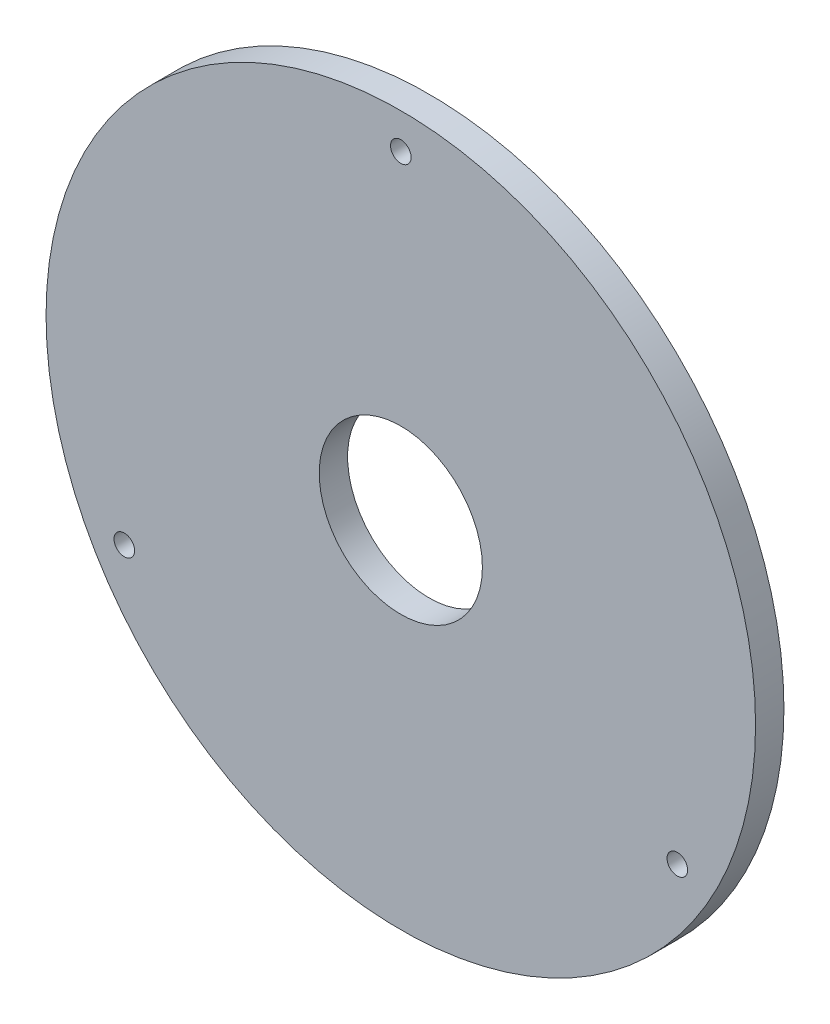
ISO-10303-21;
HEADER;
FILE_DESCRIPTION(('STEP AP214'),'2;1');
FILE_NAME('part.step','',(''),(''),'','','');
FILE_SCHEMA(('AUTOMOTIVE_DESIGN { 1 0 10303 214 1 1 1 1 }'));
ENDSEC;
DATA;
#1=APPLICATION_CONTEXT('core data for automotive mechanical design processes');
#2=APPLICATION_PROTOCOL_DEFINITION('international standard','automotive_design',2000,#1);
#3=PRODUCT_CONTEXT('',#1,'mechanical');
#4=PRODUCT('Part','Part','',(#3));
#5=PRODUCT_RELATED_PRODUCT_CATEGORY('part','',(#4));
#6=PRODUCT_DEFINITION_FORMATION('','',#4);
#7=PRODUCT_DEFINITION_CONTEXT('part definition',#1,'design');
#8=PRODUCT_DEFINITION('design','',#6,#7);
#9=PRODUCT_DEFINITION_SHAPE('','',#8);
#10=(LENGTH_UNIT() NAMED_UNIT(*) SI_UNIT(.MILLI.,.METRE.));
#11=(NAMED_UNIT(*) PLANE_ANGLE_UNIT() SI_UNIT($,.RADIAN.));
#12=(NAMED_UNIT(*) SI_UNIT($,.STERADIAN.) SOLID_ANGLE_UNIT());
#13=UNCERTAINTY_MEASURE_WITH_UNIT(LENGTH_MEASURE(1.E-05),#10,'distance_accuracy_value','');
#14=(GEOMETRIC_REPRESENTATION_CONTEXT(3) GLOBAL_UNCERTAINTY_ASSIGNED_CONTEXT((#13)) GLOBAL_UNIT_ASSIGNED_CONTEXT((#10,
#11,#12)) REPRESENTATION_CONTEXT('',''));
#15=CARTESIAN_POINT('',(0.,0.,0.));
#16=DIRECTION('',(0.,0.,1.));
#17=DIRECTION('',(1.,0.,0.));
#18=AXIS2_PLACEMENT_3D('',#15,#16,#17);
#19=CARTESIAN_POINT('',(0.,0.,4.));
#20=DIRECTION('',(0.,0.,1.));
#21=DIRECTION('',(1.,0.,0.));
#22=AXIS2_PLACEMENT_3D('',#19,#20,#21);
#23=PLANE('',#22);
#24=CARTESIAN_POINT('',(38.9711431703026,-22.4999999999983,4.));
#25=DIRECTION('',(0.,0.,1.));
#26=DIRECTION('',(1.,0.,0.));
#27=AXIS2_PLACEMENT_3D('',#24,#25,#26);
#28=CIRCLE('',#27,1.45000000000247);
#29=CARTESIAN_POINT('',(40.4211431703051,-22.4999999999983,4.));
#30=VERTEX_POINT('',#29);
#31=EDGE_CURVE('E53',#30,#30,#28,.T.);
#32=ORIENTED_EDGE('',*,*,#31,.F.);
#33=EDGE_LOOP('',(#32));
#34=FACE_BOUND('',#33,.T.);
#35=CARTESIAN_POINT('',(0.,0.,4.));
#36=DIRECTION('',(0.,0.,1.));
#37=DIRECTION('',(1.,0.,0.));
#38=AXIS2_PLACEMENT_3D('',#35,#36,#37);
#39=CIRCLE('',#38,11.5);
#40=CARTESIAN_POINT('',(11.5,0.,4.));
#41=VERTEX_POINT('',#40);
#42=EDGE_CURVE('E42',#41,#41,#39,.T.);
#43=ORIENTED_EDGE('',*,*,#42,.F.);
#44=EDGE_LOOP('',(#43));
#45=FACE_BOUND('',#44,.T.);
#46=CARTESIAN_POINT('',(0.,0.,4.));
#47=DIRECTION('',(0.,0.,1.));
#48=DIRECTION('',(1.,0.,0.));
#49=AXIS2_PLACEMENT_3D('',#46,#47,#48);
#50=CIRCLE('',#49,50.);
#51=CARTESIAN_POINT('',(50.,0.,4.));
#52=VERTEX_POINT('',#51);
#53=EDGE_CURVE('E10',#52,#52,#50,.T.);
#54=ORIENTED_EDGE('',*,*,#53,.T.);
#55=EDGE_LOOP('',(#54));
#56=FACE_BOUND('',#55,.T.);
#57=CARTESIAN_POINT('',(0.,45.,4.));
#58=DIRECTION('',(0.,0.,1.));
#59=DIRECTION('',(1.,0.,0.));
#60=AXIS2_PLACEMENT_3D('',#57,#58,#59);
#61=CIRCLE('',#60,1.45);
#62=CARTESIAN_POINT('',(1.45,45.,4.));
#63=VERTEX_POINT('',#62);
#64=EDGE_CURVE('E47',#63,#63,#61,.T.);
#65=ORIENTED_EDGE('',*,*,#64,.F.);
#66=EDGE_LOOP('',(#65));
#67=FACE_BOUND('',#66,.T.);
#68=CARTESIAN_POINT('',(-38.9711431702969,-22.5000000000017,4.));
#69=DIRECTION('',(0.,0.,1.));
#70=DIRECTION('',(1.,0.,0.));
#71=AXIS2_PLACEMENT_3D('',#68,#69,#70);
#72=CIRCLE('',#71,1.45000000000364);
#73=CARTESIAN_POINT('',(-37.5211431702932,-22.5000000000017,4.));
#74=VERTEX_POINT('',#73);
#75=EDGE_CURVE('E59',#74,#74,#72,.T.);
#76=ORIENTED_EDGE('',*,*,#75,.F.);
#77=EDGE_LOOP('',(#76));
#78=FACE_BOUND('',#77,.T.);
#79=ADVANCED_FACE('F31',(#34,#45,#56,#67,#78),#23,.T.);
#80=CARTESIAN_POINT('',(0.,0.,0.));
#81=DIRECTION('',(0.,0.,1.));
#82=DIRECTION('',(1.,0.,0.));
#83=AXIS2_PLACEMENT_3D('',#80,#81,#82);
#84=PLANE('',#83);
#85=CARTESIAN_POINT('',(0.,0.,0.));
#86=DIRECTION('',(0.,0.,1.));
#87=DIRECTION('',(1.,0.,0.));
#88=AXIS2_PLACEMENT_3D('',#85,#86,#87);
#89=CIRCLE('',#88,50.);
#90=CARTESIAN_POINT('',(50.,0.,0.));
#91=VERTEX_POINT('',#90);
#92=EDGE_CURVE('E35',#91,#91,#89,.T.);
#93=ORIENTED_EDGE('',*,*,#92,.F.);
#94=EDGE_LOOP('',(#93));
#95=FACE_BOUND('',#94,.T.);
#96=CARTESIAN_POINT('',(0.,0.,0.));
#97=DIRECTION('',(0.,0.,1.));
#98=DIRECTION('',(1.,0.,0.));
#99=AXIS2_PLACEMENT_3D('',#96,#97,#98);
#100=CIRCLE('',#99,11.5);
#101=CARTESIAN_POINT('',(11.5,0.,0.));
#102=VERTEX_POINT('',#101);
#103=EDGE_CURVE('E44',#102,#102,#100,.T.);
#104=ORIENTED_EDGE('',*,*,#103,.T.);
#105=EDGE_LOOP('',(#104));
#106=FACE_BOUND('',#105,.T.);
#107=CARTESIAN_POINT('',(0.,45.,0.));
#108=DIRECTION('',(0.,0.,1.));
#109=DIRECTION('',(1.,0.,0.));
#110=AXIS2_PLACEMENT_3D('',#107,#108,#109);
#111=CIRCLE('',#110,1.45);
#112=CARTESIAN_POINT('',(1.45,45.,0.));
#113=VERTEX_POINT('',#112);
#114=EDGE_CURVE('E50',#113,#113,#111,.T.);
#115=ORIENTED_EDGE('',*,*,#114,.T.);
#116=EDGE_LOOP('',(#115));
#117=FACE_BOUND('',#116,.T.);
#118=CARTESIAN_POINT('',(38.9711431703026,-22.4999999999983,0.));
#119=DIRECTION('',(0.,0.,1.));
#120=DIRECTION('',(1.,0.,0.));
#121=AXIS2_PLACEMENT_3D('',#118,#119,#120);
#122=CIRCLE('',#121,1.45000000000247);
#123=CARTESIAN_POINT('',(40.4211431703051,-22.4999999999983,0.));
#124=VERTEX_POINT('',#123);
#125=EDGE_CURVE('E56',#124,#124,#122,.T.);
#126=ORIENTED_EDGE('',*,*,#125,.T.);
#127=EDGE_LOOP('',(#126));
#128=FACE_BOUND('',#127,.T.);
#129=CARTESIAN_POINT('',(-38.9711431702969,-22.5000000000017,0.));
#130=DIRECTION('',(0.,0.,1.));
#131=DIRECTION('',(1.,0.,0.));
#132=AXIS2_PLACEMENT_3D('',#129,#130,#131);
#133=CIRCLE('',#132,1.45000000000364);
#134=CARTESIAN_POINT('',(-37.5211431702932,-22.5000000000017,0.));
#135=VERTEX_POINT('',#134);
#136=EDGE_CURVE('E62',#135,#135,#133,.T.);
#137=ORIENTED_EDGE('',*,*,#136,.T.);
#138=EDGE_LOOP('',(#137));
#139=FACE_BOUND('',#138,.T.);
#140=ADVANCED_FACE('F72',(#95,#106,#117,#128,#139),#84,.F.);
#141=CARTESIAN_POINT('',(0.,0.,4.));
#142=DIRECTION('',(0.,0.,-1.));
#143=DIRECTION('',(-1.,0.,0.));
#144=AXIS2_PLACEMENT_3D('',#141,#142,#143);
#145=CYLINDRICAL_SURFACE('',#144,50.);
#146=ORIENTED_EDGE('',*,*,#53,.F.);
#147=EDGE_LOOP('',(#146));
#148=FACE_BOUND('',#147,.T.);
#149=ORIENTED_EDGE('',*,*,#92,.T.);
#150=EDGE_LOOP('',(#149));
#151=FACE_BOUND('',#150,.T.);
#152=ADVANCED_FACE('F33',(#148,#151),#145,.T.);
#153=CARTESIAN_POINT('',(0.,0.,4.));
#154=DIRECTION('',(0.,0.,-1.));
#155=DIRECTION('',(-1.,0.,0.));
#156=AXIS2_PLACEMENT_3D('',#153,#154,#155);
#157=CYLINDRICAL_SURFACE('',#156,11.5);
#158=ORIENTED_EDGE('',*,*,#42,.T.);
#159=EDGE_LOOP('',(#158));
#160=FACE_BOUND('',#159,.T.);
#161=ORIENTED_EDGE('',*,*,#103,.F.);
#162=EDGE_LOOP('',(#161));
#163=FACE_BOUND('',#162,.T.);
#164=ADVANCED_FACE('F82',(#160,#163),#157,.F.);
#165=CARTESIAN_POINT('',(0.,45.,4.));
#166=DIRECTION('',(0.,0.,-1.));
#167=DIRECTION('',(-1.,0.,0.));
#168=AXIS2_PLACEMENT_3D('',#165,#166,#167);
#169=CYLINDRICAL_SURFACE('',#168,1.45);
#170=ORIENTED_EDGE('',*,*,#64,.T.);
#171=EDGE_LOOP('',(#170));
#172=FACE_BOUND('',#171,.T.);
#173=ORIENTED_EDGE('',*,*,#114,.F.);
#174=EDGE_LOOP('',(#173));
#175=FACE_BOUND('',#174,.T.);
#176=ADVANCED_FACE('F85',(#172,#175),#169,.F.);
#177=CARTESIAN_POINT('',(38.9711431703026,-22.4999999999983,4.));
#178=DIRECTION('',(0.,0.,-1.));
#179=DIRECTION('',(-1.,0.,0.));
#180=AXIS2_PLACEMENT_3D('',#177,#178,#179);
#181=CYLINDRICAL_SURFACE('',#180,1.45000000000247);
#182=ORIENTED_EDGE('',*,*,#31,.T.);
#183=EDGE_LOOP('',(#182));
#184=FACE_BOUND('',#183,.T.);
#185=ORIENTED_EDGE('',*,*,#125,.F.);
#186=EDGE_LOOP('',(#185));
#187=FACE_BOUND('',#186,.T.);
#188=ADVANCED_FACE('F89',(#184,#187),#181,.F.);
#189=CARTESIAN_POINT('',(-38.9711431702969,-22.5000000000017,4.));
#190=DIRECTION('',(0.,0.,-1.));
#191=DIRECTION('',(-1.,0.,0.));
#192=AXIS2_PLACEMENT_3D('',#189,#190,#191);
#193=CYLINDRICAL_SURFACE('',#192,1.45000000000364);
#194=ORIENTED_EDGE('',*,*,#75,.T.);
#195=EDGE_LOOP('',(#194));
#196=FACE_BOUND('',#195,.T.);
#197=ORIENTED_EDGE('',*,*,#136,.F.);
#198=EDGE_LOOP('',(#197));
#199=FACE_BOUND('',#198,.T.);
#200=ADVANCED_FACE('F68',(#196,#199),#193,.F.);
#201=CLOSED_SHELL('',(#79,#140,#152,#164,#176,#188,#200));
#202=MANIFOLD_SOLID_BREP('B2',#201);
#203=ADVANCED_BREP_SHAPE_REPRESENTATION('',(#18,#202),#14);
#204=SHAPE_DEFINITION_REPRESENTATION(#9,#203);
ENDSEC;
END-ISO-10303-21;
